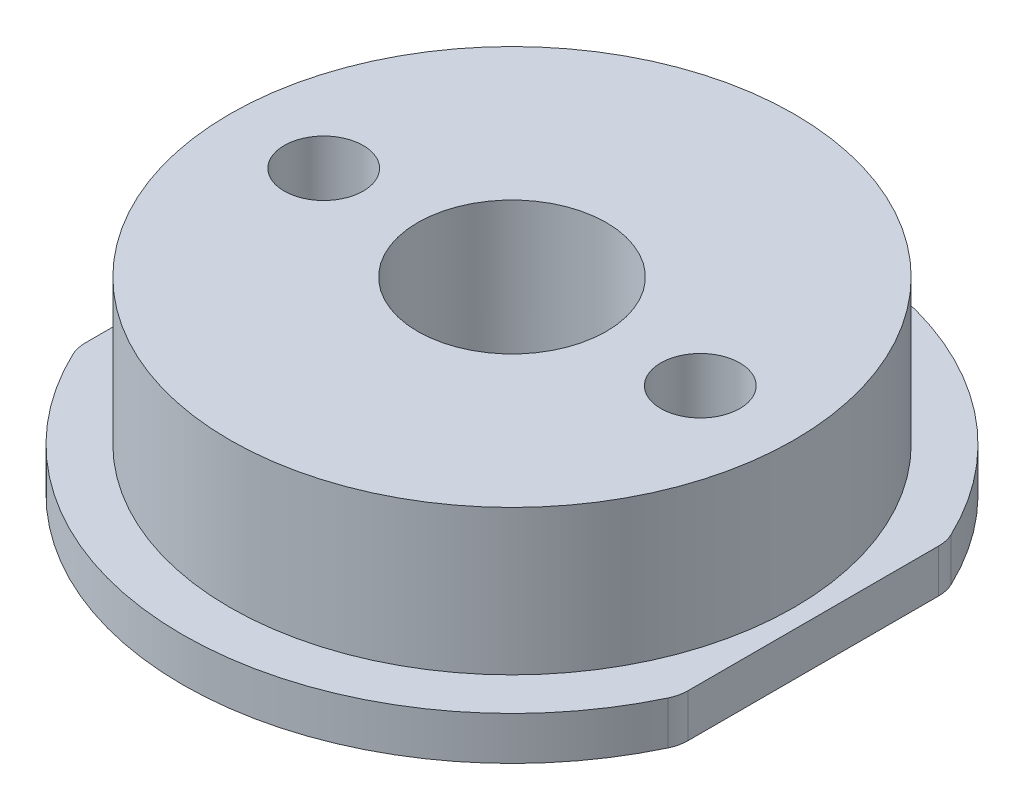
ISO-10303-21;
HEADER;
FILE_DESCRIPTION(('STEP AP214'),'2;1');
FILE_NAME('part.step','',(''),(''),'','','');
FILE_SCHEMA(('AUTOMOTIVE_DESIGN { 1 0 10303 214 1 1 1 1 }'));
ENDSEC;
DATA;
#1=APPLICATION_CONTEXT('core data for automotive mechanical design processes');
#2=APPLICATION_PROTOCOL_DEFINITION('international standard','automotive_design',2000,#1);
#3=PRODUCT_CONTEXT('',#1,'mechanical');
#4=PRODUCT('Part','Part','',(#3));
#5=PRODUCT_RELATED_PRODUCT_CATEGORY('part','',(#4));
#6=PRODUCT_DEFINITION_FORMATION('','',#4);
#7=PRODUCT_DEFINITION_CONTEXT('part definition',#1,'design');
#8=PRODUCT_DEFINITION('design','',#6,#7);
#9=PRODUCT_DEFINITION_SHAPE('','',#8);
#10=(LENGTH_UNIT() NAMED_UNIT(*) SI_UNIT(.MILLI.,.METRE.));
#11=(NAMED_UNIT(*) PLANE_ANGLE_UNIT() SI_UNIT($,.RADIAN.));
#12=(NAMED_UNIT(*) SI_UNIT($,.STERADIAN.) SOLID_ANGLE_UNIT());
#13=UNCERTAINTY_MEASURE_WITH_UNIT(LENGTH_MEASURE(1.E-05),#10,'distance_accuracy_value','');
#14=(GEOMETRIC_REPRESENTATION_CONTEXT(3) GLOBAL_UNCERTAINTY_ASSIGNED_CONTEXT((#13)) GLOBAL_UNIT_ASSIGNED_CONTEXT((#10,
#11,#12)) REPRESENTATION_CONTEXT('',''));
#15=CARTESIAN_POINT('',(0.,0.,0.));
#16=DIRECTION('',(0.,0.,1.));
#17=DIRECTION('',(1.,0.,0.));
#18=AXIS2_PLACEMENT_3D('',#15,#16,#17);
#19=CARTESIAN_POINT('',(0.,2.3,0.));
#20=DIRECTION('',(0.,-1.,0.));
#21=DIRECTION('',(0.,0.,-1.));
#22=AXIS2_PLACEMENT_3D('',#19,#20,#21);
#23=CYLINDRICAL_SURFACE('',#22,17.5);
#24=CARTESIAN_POINT('',(0.,0.,0.));
#25=DIRECTION('',(0.,1.,0.));
#26=DIRECTION('',(0.,0.,1.));
#27=AXIS2_PLACEMENT_3D('',#24,#25,#26);
#28=CIRCLE('',#27,17.5);
#29=CARTESIAN_POINT('',(-15.8064516129032,0.,7.51039861851214));
#30=VERTEX_POINT('',#29);
#31=CARTESIAN_POINT('',(15.8064516129032,0.,7.51039861851214));
#32=VERTEX_POINT('',#31);
#33=EDGE_CURVE('E144',#30,#32,#28,.T.);
#34=ORIENTED_EDGE('',*,*,#33,.T.);
#35=DIRECTION('',(0.,-1.,0.));
#36=VECTOR('',#35,1.);
#37=CARTESIAN_POINT('',(15.8064516129032,2.3,7.51039861851214));
#38=LINE('',#37,#36);
#39=CARTESIAN_POINT('',(15.8064516129032,2.3,7.51039861851214));
#40=VERTEX_POINT('',#39);
#41=EDGE_CURVE('E11',#32,#40,#38,.F.);
#42=ORIENTED_EDGE('',*,*,#41,.T.);
#43=CARTESIAN_POINT('',(0.,2.3,0.));
#44=DIRECTION('',(0.,1.,0.));
#45=DIRECTION('',(0.,0.,1.));
#46=AXIS2_PLACEMENT_3D('',#43,#44,#45);
#47=CIRCLE('',#46,17.5);
#48=CARTESIAN_POINT('',(-15.8064516129032,2.3,7.51039861851214));
#49=VERTEX_POINT('',#48);
#50=EDGE_CURVE('E146',#49,#40,#47,.T.);
#51=ORIENTED_EDGE('',*,*,#50,.F.);
#52=DIRECTION('',(0.,-1.,0.));
#53=VECTOR('',#52,1.);
#54=CARTESIAN_POINT('',(-15.8064516129032,2.3,7.51039861851214));
#55=LINE('',#54,#53);
#56=EDGE_CURVE('E44',#49,#30,#55,.T.);
#57=ORIENTED_EDGE('',*,*,#56,.T.);
#58=EDGE_LOOP('',(#34,#42,#51,#57));
#59=FACE_BOUND('',#58,.T.);
#60=ADVANCED_FACE('F36',(#59),#23,.T.);
#61=CARTESIAN_POINT('',(15.8064516129032,0.,-7.51039861851214));
#62=VERTEX_POINT('',#61);
#63=CARTESIAN_POINT('',(-15.8064516129032,0.,-7.51039861851214));
#64=VERTEX_POINT('',#63);
#65=EDGE_CURVE('E152',#62,#64,#28,.T.);
#66=ORIENTED_EDGE('',*,*,#65,.T.);
#67=DIRECTION('',(0.,-1.,0.));
#68=VECTOR('',#67,1.);
#69=CARTESIAN_POINT('',(-15.8064516129032,2.3,-7.51039861851214));
#70=LINE('',#69,#68);
#71=CARTESIAN_POINT('',(-15.8064516129032,2.3,-7.51039861851214));
#72=VERTEX_POINT('',#71);
#73=EDGE_CURVE('E128',#64,#72,#70,.F.);
#74=ORIENTED_EDGE('',*,*,#73,.T.);
#75=CARTESIAN_POINT('',(15.8064516129032,2.3,-7.51039861851214));
#76=VERTEX_POINT('',#75);
#77=EDGE_CURVE('E173',#76,#72,#47,.T.);
#78=ORIENTED_EDGE('',*,*,#77,.F.);
#79=DIRECTION('',(0.,-1.,0.));
#80=VECTOR('',#79,1.);
#81=CARTESIAN_POINT('',(15.8064516129032,2.3,-7.51039861851214));
#82=LINE('',#81,#80);
#83=EDGE_CURVE('E132',#76,#62,#82,.T.);
#84=ORIENTED_EDGE('',*,*,#83,.T.);
#85=EDGE_LOOP('',(#66,#74,#78,#84));
#86=FACE_BOUND('',#85,.T.);
#87=ADVANCED_FACE('F171',(#86),#23,.T.);
#88=CARTESIAN_POINT('',(0.,2.3,0.));
#89=DIRECTION('',(0.,1.,0.));
#90=DIRECTION('',(0.,0.,1.));
#91=AXIS2_PLACEMENT_3D('',#88,#89,#90);
#92=PLANE('',#91);
#93=ORIENTED_EDGE('',*,*,#77,.T.);
#94=CARTESIAN_POINT('',(-14.,2.3,-6.65206734782504));
#95=DIRECTION('',(0.,1.,0.));
#96=DIRECTION('',(0.,0.,1.));
#97=AXIS2_PLACEMENT_3D('',#94,#95,#96);
#98=CIRCLE('',#97,2.);
#99=CARTESIAN_POINT('',(-16.,2.3,-6.65206734782504));
#100=VERTEX_POINT('',#99);
#101=EDGE_CURVE('E122',#72,#100,#98,.T.);
#102=ORIENTED_EDGE('',*,*,#101,.T.);
#103=DIRECTION('',(0.,0.,-1.));
#104=VECTOR('',#103,1.);
#105=CARTESIAN_POINT('',(-16.,2.3,0.));
#106=LINE('',#105,#104);
#107=CARTESIAN_POINT('',(-16.,2.3,6.65206734782504));
#108=VERTEX_POINT('',#107);
#109=EDGE_CURVE('E107',#108,#100,#106,.T.);
#110=ORIENTED_EDGE('',*,*,#109,.F.);
#111=CARTESIAN_POINT('',(-14.,2.3,6.65206734782504));
#112=DIRECTION('',(0.,1.,0.));
#113=DIRECTION('',(0.,0.,1.));
#114=AXIS2_PLACEMENT_3D('',#111,#112,#113);
#115=CIRCLE('',#114,2.);
#116=EDGE_CURVE('E119',#108,#49,#115,.T.);
#117=ORIENTED_EDGE('',*,*,#116,.T.);
#118=ORIENTED_EDGE('',*,*,#50,.T.);
#119=CARTESIAN_POINT('',(14.,2.3,6.65206734782504));
#120=DIRECTION('',(0.,1.,0.));
#121=DIRECTION('',(0.,0.,1.));
#122=AXIS2_PLACEMENT_3D('',#119,#120,#121);
#123=CIRCLE('',#122,2.);
#124=CARTESIAN_POINT('',(16.,2.3,6.65206734782504));
#125=VERTEX_POINT('',#124);
#126=EDGE_CURVE('E51',#40,#125,#123,.T.);
#127=ORIENTED_EDGE('',*,*,#126,.T.);
#128=DIRECTION('',(0.,0.,1.));
#129=VECTOR('',#128,1.);
#130=CARTESIAN_POINT('',(16.,2.3,0.));
#131=LINE('',#130,#129);
#132=CARTESIAN_POINT('',(16.,2.3,-6.65206734782504));
#133=VERTEX_POINT('',#132);
#134=EDGE_CURVE('E124',#133,#125,#131,.T.);
#135=ORIENTED_EDGE('',*,*,#134,.F.);
#136=CARTESIAN_POINT('',(14.,2.3,-6.65206734782504));
#137=DIRECTION('',(0.,1.,0.));
#138=DIRECTION('',(0.,0.,1.));
#139=AXIS2_PLACEMENT_3D('',#136,#137,#138);
#140=CIRCLE('',#139,2.);
#141=EDGE_CURVE('E130',#133,#76,#140,.T.);
#142=ORIENTED_EDGE('',*,*,#141,.T.);
#143=EDGE_LOOP('',(#93,#102,#110,#117,#118,#127,#135,#142));
#144=FACE_BOUND('',#143,.T.);
#145=CARTESIAN_POINT('',(0.,2.3,0.));
#146=DIRECTION('',(0.,1.,0.));
#147=DIRECTION('',(0.,0.,1.));
#148=AXIS2_PLACEMENT_3D('',#145,#146,#147);
#149=CIRCLE('',#148,14.99);
#150=CARTESIAN_POINT('',(0.,2.3,14.99));
#151=VERTEX_POINT('',#150);
#152=EDGE_CURVE('E114',#151,#151,#149,.T.);
#153=ORIENTED_EDGE('',*,*,#152,.F.);
#154=EDGE_LOOP('',(#153));
#155=FACE_BOUND('',#154,.T.);
#156=ADVANCED_FACE('F117',(#144,#155),#92,.T.);
#157=CARTESIAN_POINT('',(0.,0.,0.));
#158=DIRECTION('',(0.,1.,0.));
#159=DIRECTION('',(0.,0.,1.));
#160=AXIS2_PLACEMENT_3D('',#157,#158,#159);
#161=PLANE('',#160);
#162=CARTESIAN_POINT('',(10.,0.,0.));
#163=DIRECTION('',(0.,-1.,0.));
#164=DIRECTION('',(0.,0.,-1.));
#165=AXIS2_PLACEMENT_3D('',#162,#163,#164);
#166=CIRCLE('',#165,2.1);
#167=CARTESIAN_POINT('',(10.,0.,-2.1));
#168=VERTEX_POINT('',#167);
#169=EDGE_CURVE('E188',#168,#168,#166,.T.);
#170=ORIENTED_EDGE('',*,*,#169,.F.);
#171=EDGE_LOOP('',(#170));
#172=FACE_BOUND('',#171,.T.);
#173=CARTESIAN_POINT('',(-10.,0.,0.));
#174=DIRECTION('',(0.,-1.,0.));
#175=DIRECTION('',(0.,0.,1.));
#176=AXIS2_PLACEMENT_3D('',#173,#174,#175);
#177=CIRCLE('',#176,2.1);
#178=CARTESIAN_POINT('',(-10.,0.,2.1));
#179=VERTEX_POINT('',#178);
#180=EDGE_CURVE('E185',#179,#179,#177,.T.);
#181=ORIENTED_EDGE('',*,*,#180,.F.);
#182=EDGE_LOOP('',(#181));
#183=FACE_BOUND('',#182,.T.);
#184=CARTESIAN_POINT('',(0.,0.,0.));
#185=DIRECTION('',(0.,-1.,0.));
#186=DIRECTION('',(0.,0.,-1.));
#187=AXIS2_PLACEMENT_3D('',#184,#185,#186);
#188=CIRCLE('',#187,5.01);
#189=CARTESIAN_POINT('',(0.,0.,-5.01));
#190=VERTEX_POINT('',#189);
#191=EDGE_CURVE('E195',#190,#190,#188,.T.);
#192=ORIENTED_EDGE('',*,*,#191,.F.);
#193=EDGE_LOOP('',(#192));
#194=FACE_BOUND('',#193,.T.);
#195=DIRECTION('',(0.,0.,1.));
#196=VECTOR('',#195,1.);
#197=CARTESIAN_POINT('',(-16.,0.,7.08872343937892));
#198=LINE('',#197,#196);
#199=CARTESIAN_POINT('',(-16.,0.,-6.65206734782504));
#200=VERTEX_POINT('',#199);
#201=CARTESIAN_POINT('',(-16.,0.,6.65206734782504));
#202=VERTEX_POINT('',#201);
#203=EDGE_CURVE('E110',#200,#202,#198,.T.);
#204=ORIENTED_EDGE('',*,*,#203,.F.);
#205=CARTESIAN_POINT('',(-14.,0.,-6.65206734782504));
#206=DIRECTION('',(0.,1.,0.));
#207=DIRECTION('',(0.,0.,1.));
#208=AXIS2_PLACEMENT_3D('',#205,#206,#207);
#209=CIRCLE('',#208,2.);
#210=EDGE_CURVE('E165',#200,#64,#209,.F.);
#211=ORIENTED_EDGE('',*,*,#210,.T.);
#212=ORIENTED_EDGE('',*,*,#65,.F.);
#213=CARTESIAN_POINT('',(14.,0.,-6.65206734782504));
#214=DIRECTION('',(0.,1.,0.));
#215=DIRECTION('',(0.,0.,1.));
#216=AXIS2_PLACEMENT_3D('',#213,#214,#215);
#217=CIRCLE('',#216,2.);
#218=CARTESIAN_POINT('',(16.,0.,-6.65206734782503));
#219=VERTEX_POINT('',#218);
#220=EDGE_CURVE('E163',#62,#219,#217,.F.);
#221=ORIENTED_EDGE('',*,*,#220,.T.);
#222=DIRECTION('',(0.,0.,-1.));
#223=VECTOR('',#222,1.);
#224=CARTESIAN_POINT('',(16.,0.,7.08872343937892));
#225=LINE('',#224,#223);
#226=CARTESIAN_POINT('',(16.,0.,6.65206734782504));
#227=VERTEX_POINT('',#226);
#228=EDGE_CURVE('E183',#227,#219,#225,.T.);
#229=ORIENTED_EDGE('',*,*,#228,.F.);
#230=CARTESIAN_POINT('',(14.,0.,6.65206734782504));
#231=DIRECTION('',(0.,1.,0.));
#232=DIRECTION('',(0.,0.,1.));
#233=AXIS2_PLACEMENT_3D('',#230,#231,#232);
#234=CIRCLE('',#233,2.);
#235=EDGE_CURVE('E151',#227,#32,#234,.F.);
#236=ORIENTED_EDGE('',*,*,#235,.T.);
#237=ORIENTED_EDGE('',*,*,#33,.F.);
#238=CARTESIAN_POINT('',(-14.,0.,6.65206734782504));
#239=DIRECTION('',(0.,1.,0.));
#240=DIRECTION('',(0.,0.,1.));
#241=AXIS2_PLACEMENT_3D('',#238,#239,#240);
#242=CIRCLE('',#241,2.);
#243=EDGE_CURVE('E149',#30,#202,#242,.F.);
#244=ORIENTED_EDGE('',*,*,#243,.T.);
#245=EDGE_LOOP('',(#204,#211,#212,#221,#229,#236,#237,#244));
#246=FACE_BOUND('',#245,.T.);
#247=ADVANCED_FACE('F148',(#172,#183,#194,#246),#161,.F.);
#248=CARTESIAN_POINT('',(0.,10.,0.));
#249=DIRECTION('',(0.,-1.,0.));
#250=DIRECTION('',(0.,0.,-1.));
#251=AXIS2_PLACEMENT_3D('',#248,#249,#250);
#252=CYLINDRICAL_SURFACE('',#251,14.99);
#253=CARTESIAN_POINT('',(0.,10.,0.));
#254=DIRECTION('',(0.,1.,0.));
#255=DIRECTION('',(0.,0.,1.));
#256=AXIS2_PLACEMENT_3D('',#253,#254,#255);
#257=CIRCLE('',#256,14.99);
#258=CARTESIAN_POINT('',(0.,10.,14.99));
#259=VERTEX_POINT('',#258);
#260=EDGE_CURVE('E123',#259,#259,#257,.T.);
#261=ORIENTED_EDGE('',*,*,#260,.F.);
#262=EDGE_LOOP('',(#261));
#263=FACE_BOUND('',#262,.T.);
#264=ORIENTED_EDGE('',*,*,#152,.T.);
#265=EDGE_LOOP('',(#264));
#266=FACE_BOUND('',#265,.T.);
#267=ADVANCED_FACE('F222',(#263,#266),#252,.T.);
#268=CARTESIAN_POINT('',(0.,10.,0.));
#269=DIRECTION('',(0.,1.,0.));
#270=DIRECTION('',(0.,0.,1.));
#271=AXIS2_PLACEMENT_3D('',#268,#269,#270);
#272=PLANE('',#271);
#273=CARTESIAN_POINT('',(10.,10.,0.));
#274=DIRECTION('',(0.,1.,0.));
#275=DIRECTION('',(0.,0.,1.));
#276=AXIS2_PLACEMENT_3D('',#273,#274,#275);
#277=CIRCLE('',#276,2.1);
#278=CARTESIAN_POINT('',(10.,10.,2.1));
#279=VERTEX_POINT('',#278);
#280=EDGE_CURVE('E191',#279,#279,#277,.F.);
#281=ORIENTED_EDGE('',*,*,#280,.T.);
#282=EDGE_LOOP('',(#281));
#283=FACE_BOUND('',#282,.T.);
#284=CARTESIAN_POINT('',(-10.,10.,0.));
#285=DIRECTION('',(0.,1.,0.));
#286=DIRECTION('',(0.,0.,1.));
#287=AXIS2_PLACEMENT_3D('',#284,#285,#286);
#288=CIRCLE('',#287,2.1);
#289=CARTESIAN_POINT('',(-10.,10.,2.1));
#290=VERTEX_POINT('',#289);
#291=EDGE_CURVE('E192',#290,#290,#288,.F.);
#292=ORIENTED_EDGE('',*,*,#291,.T.);
#293=EDGE_LOOP('',(#292));
#294=FACE_BOUND('',#293,.T.);
#295=CARTESIAN_POINT('',(0.,10.,0.));
#296=DIRECTION('',(0.,1.,0.));
#297=DIRECTION('',(0.,0.,1.));
#298=AXIS2_PLACEMENT_3D('',#295,#296,#297);
#299=CIRCLE('',#298,5.01);
#300=CARTESIAN_POINT('',(0.,10.,5.01));
#301=VERTEX_POINT('',#300);
#302=EDGE_CURVE('E202',#301,#301,#299,.F.);
#303=ORIENTED_EDGE('',*,*,#302,.T.);
#304=EDGE_LOOP('',(#303));
#305=FACE_BOUND('',#304,.T.);
#306=ORIENTED_EDGE('',*,*,#260,.T.);
#307=EDGE_LOOP('',(#306));
#308=FACE_BOUND('',#307,.T.);
#309=ADVANCED_FACE('F207',(#283,#294,#305,#308),#272,.T.);
#310=CARTESIAN_POINT('',(0.,24.2565774293833,0.));
#311=DIRECTION('',(0.,-1.,0.));
#312=DIRECTION('',(0.,0.,-1.));
#313=AXIS2_PLACEMENT_3D('',#310,#311,#312);
#314=CYLINDRICAL_SURFACE('',#313,5.01);
#315=ORIENTED_EDGE('',*,*,#191,.T.);
#316=EDGE_LOOP('',(#315));
#317=FACE_BOUND('',#316,.T.);
#318=ORIENTED_EDGE('',*,*,#302,.F.);
#319=EDGE_LOOP('',(#318));
#320=FACE_BOUND('',#319,.T.);
#321=ADVANCED_FACE('F210',(#317,#320),#314,.F.);
#322=CARTESIAN_POINT('',(-10.,24.2565774293833,0.));
#323=DIRECTION('',(0.,-1.,0.));
#324=DIRECTION('',(0.,0.,-1.));
#325=AXIS2_PLACEMENT_3D('',#322,#323,#324);
#326=CYLINDRICAL_SURFACE('',#325,2.1);
#327=ORIENTED_EDGE('',*,*,#180,.T.);
#328=EDGE_LOOP('',(#327));
#329=FACE_BOUND('',#328,.T.);
#330=ORIENTED_EDGE('',*,*,#291,.F.);
#331=EDGE_LOOP('',(#330));
#332=FACE_BOUND('',#331,.T.);
#333=ADVANCED_FACE('F212',(#329,#332),#326,.F.);
#334=CARTESIAN_POINT('',(10.,24.2565774293833,0.));
#335=DIRECTION('',(0.,-1.,0.));
#336=DIRECTION('',(0.,0.,-1.));
#337=AXIS2_PLACEMENT_3D('',#334,#335,#336);
#338=CYLINDRICAL_SURFACE('',#337,2.1);
#339=ORIENTED_EDGE('',*,*,#169,.T.);
#340=EDGE_LOOP('',(#339));
#341=FACE_BOUND('',#340,.T.);
#342=ORIENTED_EDGE('',*,*,#280,.F.);
#343=EDGE_LOOP('',(#342));
#344=FACE_BOUND('',#343,.T.);
#345=ADVANCED_FACE('F219',(#341,#344),#338,.F.);
#346=CARTESIAN_POINT('',(16.,24.2565774293833,7.08872343937892));
#347=DIRECTION('',(-1.,0.,0.));
#348=DIRECTION('',(0.,0.,1.));
#349=AXIS2_PLACEMENT_3D('',#346,#347,#348);
#350=PLANE('',#349);
#351=ORIENTED_EDGE('',*,*,#228,.T.);
#352=DIRECTION('',(0.,-1.,0.));
#353=VECTOR('',#352,1.);
#354=CARTESIAN_POINT('',(16.,24.2565774293833,-6.65206734782504));
#355=LINE('',#354,#353);
#356=EDGE_CURVE('E58',#219,#133,#355,.F.);
#357=ORIENTED_EDGE('',*,*,#356,.T.);
#358=ORIENTED_EDGE('',*,*,#134,.T.);
#359=DIRECTION('',(0.,-1.,0.));
#360=VECTOR('',#359,1.);
#361=CARTESIAN_POINT('',(16.,24.2565774293833,6.65206734782504));
#362=LINE('',#361,#360);
#363=EDGE_CURVE('E138',#125,#227,#362,.T.);
#364=ORIENTED_EDGE('',*,*,#363,.T.);
#365=EDGE_LOOP('',(#351,#357,#358,#364));
#366=FACE_BOUND('',#365,.T.);
#367=ADVANCED_FACE('F182',(#366),#350,.F.);
#368=CARTESIAN_POINT('',(-16.,24.2565774293833,7.08872343937892));
#369=DIRECTION('',(1.,0.,0.));
#370=DIRECTION('',(0.,0.,-1.));
#371=AXIS2_PLACEMENT_3D('',#368,#369,#370);
#372=PLANE('',#371);
#373=ORIENTED_EDGE('',*,*,#109,.T.);
#374=DIRECTION('',(0.,-1.,0.));
#375=VECTOR('',#374,1.);
#376=CARTESIAN_POINT('',(-16.,24.2565774293833,-6.65206734782504));
#377=LINE('',#376,#375);
#378=EDGE_CURVE('E113',#100,#200,#377,.T.);
#379=ORIENTED_EDGE('',*,*,#378,.T.);
#380=ORIENTED_EDGE('',*,*,#203,.T.);
#381=DIRECTION('',(0.,-1.,0.));
#382=VECTOR('',#381,1.);
#383=CARTESIAN_POINT('',(-16.,24.2565774293833,6.65206734782504));
#384=LINE('',#383,#382);
#385=EDGE_CURVE('E103',#202,#108,#384,.F.);
#386=ORIENTED_EDGE('',*,*,#385,.T.);
#387=EDGE_LOOP('',(#373,#379,#380,#386));
#388=FACE_BOUND('',#387,.T.);
#389=ADVANCED_FACE('F105',(#388),#372,.F.);
#390=CARTESIAN_POINT('',(-14.,2.3,-6.65206734782504));
#391=DIRECTION('',(0.,-1.,0.));
#392=DIRECTION('',(0.,0.,-1.));
#393=AXIS2_PLACEMENT_3D('',#390,#391,#392);
#394=CYLINDRICAL_SURFACE('',#393,2.);
#395=ORIENTED_EDGE('',*,*,#101,.F.);
#396=ORIENTED_EDGE('',*,*,#73,.F.);
#397=ORIENTED_EDGE('',*,*,#210,.F.);
#398=ORIENTED_EDGE('',*,*,#378,.F.);
#399=EDGE_LOOP('',(#395,#396,#397,#398));
#400=FACE_BOUND('',#399,.T.);
#401=ADVANCED_FACE('F177',(#400),#394,.T.);
#402=CARTESIAN_POINT('',(14.,2.3,-6.65206734782504));
#403=DIRECTION('',(0.,-1.,0.));
#404=DIRECTION('',(0.,0.,-1.));
#405=AXIS2_PLACEMENT_3D('',#402,#403,#404);
#406=CYLINDRICAL_SURFACE('',#405,2.);
#407=ORIENTED_EDGE('',*,*,#141,.F.);
#408=ORIENTED_EDGE('',*,*,#356,.F.);
#409=ORIENTED_EDGE('',*,*,#220,.F.);
#410=ORIENTED_EDGE('',*,*,#83,.F.);
#411=EDGE_LOOP('',(#407,#408,#409,#410));
#412=FACE_BOUND('',#411,.T.);
#413=ADVANCED_FACE('F235',(#412),#406,.T.);
#414=CARTESIAN_POINT('',(14.,2.3,6.65206734782504));
#415=DIRECTION('',(0.,-1.,0.));
#416=DIRECTION('',(0.,0.,-1.));
#417=AXIS2_PLACEMENT_3D('',#414,#415,#416);
#418=CYLINDRICAL_SURFACE('',#417,2.);
#419=ORIENTED_EDGE('',*,*,#126,.F.);
#420=ORIENTED_EDGE('',*,*,#41,.F.);
#421=ORIENTED_EDGE('',*,*,#235,.F.);
#422=ORIENTED_EDGE('',*,*,#363,.F.);
#423=EDGE_LOOP('',(#419,#420,#421,#422));
#424=FACE_BOUND('',#423,.T.);
#425=ADVANCED_FACE('F181',(#424),#418,.T.);
#426=CARTESIAN_POINT('',(-14.,2.3,6.65206734782504));
#427=DIRECTION('',(0.,-1.,0.));
#428=DIRECTION('',(0.,0.,-1.));
#429=AXIS2_PLACEMENT_3D('',#426,#427,#428);
#430=CYLINDRICAL_SURFACE('',#429,2.);
#431=ORIENTED_EDGE('',*,*,#116,.F.);
#432=ORIENTED_EDGE('',*,*,#385,.F.);
#433=ORIENTED_EDGE('',*,*,#243,.F.);
#434=ORIENTED_EDGE('',*,*,#56,.F.);
#435=EDGE_LOOP('',(#431,#432,#433,#434));
#436=FACE_BOUND('',#435,.T.);
#437=ADVANCED_FACE('F38',(#436),#430,.T.);
#438=CLOSED_SHELL('',(#60,#87,#156,#247,#267,#309,#321,#333,#345,#367,#389,#401,#413,#425,#437));
#439=MANIFOLD_SOLID_BREP('B2',#438);
#440=ADVANCED_BREP_SHAPE_REPRESENTATION('',(#18,#439),#14);
#441=SHAPE_DEFINITION_REPRESENTATION(#9,#440);
ENDSEC;
END-ISO-10303-21;
